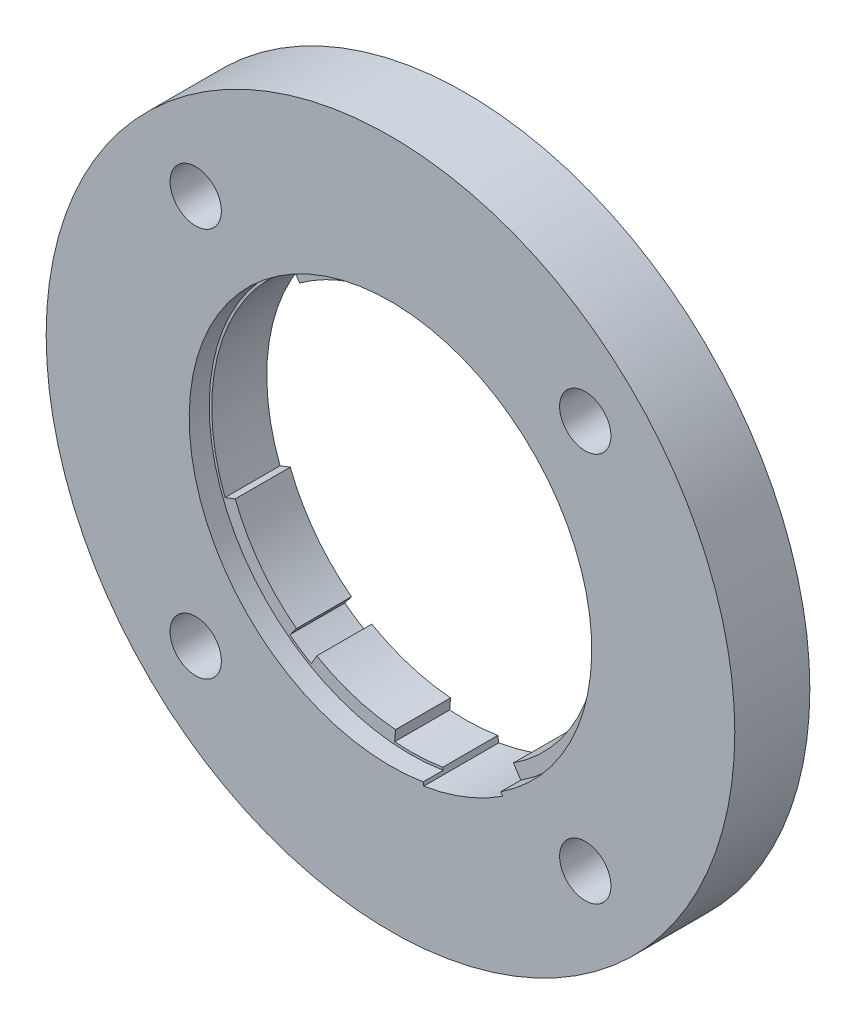
ISO-10303-21;
HEADER;
FILE_DESCRIPTION(('STEP AP214'),'2;1');
FILE_NAME('part.step','',(''),(''),'','','');
FILE_SCHEMA(('AUTOMOTIVE_DESIGN { 1 0 10303 214 1 1 1 1 }'));
ENDSEC;
DATA;
#1=APPLICATION_CONTEXT('core data for automotive mechanical design processes');
#2=APPLICATION_PROTOCOL_DEFINITION('international standard','automotive_design',2000,#1);
#3=PRODUCT_CONTEXT('',#1,'mechanical');
#4=PRODUCT('Part','Part','',(#3));
#5=PRODUCT_RELATED_PRODUCT_CATEGORY('part','',(#4));
#6=PRODUCT_DEFINITION_FORMATION('','',#4);
#7=PRODUCT_DEFINITION_CONTEXT('part definition',#1,'design');
#8=PRODUCT_DEFINITION('design','',#6,#7);
#9=PRODUCT_DEFINITION_SHAPE('','',#8);
#10=(LENGTH_UNIT() NAMED_UNIT(*) SI_UNIT(.MILLI.,.METRE.));
#11=(NAMED_UNIT(*) PLANE_ANGLE_UNIT() SI_UNIT($,.RADIAN.));
#12=(NAMED_UNIT(*) SI_UNIT($,.STERADIAN.) SOLID_ANGLE_UNIT());
#13=UNCERTAINTY_MEASURE_WITH_UNIT(LENGTH_MEASURE(1.E-05),#10,'distance_accuracy_value','');
#14=(GEOMETRIC_REPRESENTATION_CONTEXT(3) GLOBAL_UNCERTAINTY_ASSIGNED_CONTEXT((#13)) GLOBAL_UNIT_ASSIGNED_CONTEXT((#10,
#11,#12)) REPRESENTATION_CONTEXT('',''));
#15=CARTESIAN_POINT('',(0.,0.,0.));
#16=DIRECTION('',(0.,0.,1.));
#17=DIRECTION('',(1.,0.,0.));
#18=AXIS2_PLACEMENT_3D('',#15,#16,#17);
#19=CARTESIAN_POINT('',(0.,0.,1.02447722221638));
#20=DIRECTION('',(0.,0.,1.));
#21=DIRECTION('',(1.,0.,0.));
#22=AXIS2_PLACEMENT_3D('',#19,#20,#21);
#23=CYLINDRICAL_SURFACE('',#22,15.875);
#24=DIRECTION('',(0.,0.,-1.));
#25=VECTOR('',#24,1.);
#26=CARTESIAN_POINT('',(-2.25753554217916,15.7136615171575,31.5336184854115));
#27=LINE('',#26,#25);
#28=CARTESIAN_POINT('',(-2.25753554217916,15.7136615171575,4.394));
#29=VERTEX_POINT('',#28);
#30=CARTESIAN_POINT('',(-2.25753554217916,15.7136615171575,0.));
#31=VERTEX_POINT('',#30);
#32=EDGE_CURVE('E179',#29,#31,#27,.T.);
#33=ORIENTED_EDGE('',*,*,#32,.T.);
#34=CARTESIAN_POINT('',(0.,0.,0.));
#35=DIRECTION('',(0.,0.,1.));
#36=DIRECTION('',(1.,0.,0.));
#37=AXIS2_PLACEMENT_3D('',#34,#35,#36);
#38=CIRCLE('',#37,15.875);
#39=CARTESIAN_POINT('',(10.6425306707465,11.7793109273089,0.));
#40=VERTEX_POINT('',#39);
#41=EDGE_CURVE('E182',#40,#31,#38,.T.);
#42=ORIENTED_EDGE('',*,*,#41,.F.);
#43=DIRECTION('',(0.,0.,-1.));
#44=VECTOR('',#43,1.);
#45=CARTESIAN_POINT('',(10.6425306707465,11.7793109273089,31.5336184854115));
#46=LINE('',#45,#44);
#47=CARTESIAN_POINT('',(10.6425306707465,11.7793109273089,4.394));
#48=VERTEX_POINT('',#47);
#49=EDGE_CURVE('E284',#48,#40,#46,.T.);
#50=ORIENTED_EDGE('',*,*,#49,.F.);
#51=CARTESIAN_POINT('',(0.,0.,4.394));
#52=DIRECTION('',(0.,0.,1.));
#53=DIRECTION('',(1.,0.,0.));
#54=AXIS2_PLACEMENT_3D('',#51,#52,#53);
#55=CIRCLE('',#54,15.875);
#56=EDGE_CURVE('E184',#48,#29,#55,.T.);
#57=ORIENTED_EDGE('',*,*,#56,.T.);
#58=EDGE_LOOP('',(#33,#42,#50,#57));
#59=FACE_BOUND('',#58,.T.);
#60=ADVANCED_FACE('F41',(#59),#23,.F.);
#61=CARTESIAN_POINT('',(-9.36283564568387,12.8200208140202,0.));
#62=VERTEX_POINT('',#61);
#63=CARTESIAN_POINT('',(-14.8133156697239,-5.70800349238792,0.));
#64=VERTEX_POINT('',#63);
#65=EDGE_CURVE('E202',#62,#64,#38,.T.);
#66=ORIENTED_EDGE('',*,*,#65,.F.);
#67=DIRECTION('',(0.,0.,-1.));
#68=VECTOR('',#67,1.);
#69=CARTESIAN_POINT('',(-9.36283564568387,12.8200208140202,31.5336184854115));
#70=LINE('',#69,#68);
#71=CARTESIAN_POINT('',(-9.36283564568387,12.8200208140202,4.394));
#72=VERTEX_POINT('',#71);
#73=EDGE_CURVE('E190',#72,#62,#70,.T.);
#74=ORIENTED_EDGE('',*,*,#73,.F.);
#75=CARTESIAN_POINT('',(-14.8133156697239,-5.70800349238792,4.394));
#76=VERTEX_POINT('',#75);
#77=EDGE_CURVE('E320',#72,#76,#55,.T.);
#78=ORIENTED_EDGE('',*,*,#77,.T.);
#79=DIRECTION('',(0.,0.,-1.));
#80=VECTOR('',#79,1.);
#81=CARTESIAN_POINT('',(-14.8133156697239,-5.70800349238792,31.5336184854115));
#82=LINE('',#81,#80);
#83=EDGE_CURVE('E246',#76,#64,#82,.T.);
#84=ORIENTED_EDGE('',*,*,#83,.T.);
#85=EDGE_LOOP('',(#66,#74,#78,#84));
#86=FACE_BOUND('',#85,.T.);
#87=ADVANCED_FACE('F361',(#86),#23,.F.);
#88=CARTESIAN_POINT('',(-9.64214090906731,-12.6112942908209,0.));
#89=VERTEX_POINT('',#88);
#90=CARTESIAN_POINT('',(-7.9242350534155,-13.755803277825,0.));
#91=VERTEX_POINT('',#90);
#92=EDGE_CURVE('E364',#89,#91,#38,.T.);
#93=ORIENTED_EDGE('',*,*,#92,.F.);
#94=DIRECTION('',(0.,0.,-1.));
#95=VECTOR('',#94,1.);
#96=CARTESIAN_POINT('',(-9.64214090906731,-12.6112942908209,31.5336184854115));
#97=LINE('',#96,#95);
#98=CARTESIAN_POINT('',(-9.64214090906731,-12.6112942908209,4.394));
#99=VERTEX_POINT('',#98);
#100=EDGE_CURVE('E249',#99,#89,#97,.T.);
#101=ORIENTED_EDGE('',*,*,#100,.F.);
#102=CARTESIAN_POINT('',(-7.9242350534155,-13.755803277825,4.394));
#103=VERTEX_POINT('',#102);
#104=EDGE_CURVE('E378',#99,#103,#55,.T.);
#105=ORIENTED_EDGE('',*,*,#104,.T.);
#106=DIRECTION('',(0.,0.,-1.));
#107=VECTOR('',#106,1.);
#108=CARTESIAN_POINT('',(-7.92423505341551,-13.755803277825,31.5336184854115));
#109=LINE('',#108,#107);
#110=EDGE_CURVE('E258',#103,#91,#109,.T.);
#111=ORIENTED_EDGE('',*,*,#110,.T.);
#112=EDGE_LOOP('',(#93,#101,#105,#111));
#113=FACE_BOUND('',#112,.T.);
#114=ADVANCED_FACE('F381',(#113),#23,.F.);
#115=CARTESIAN_POINT('',(-1.26611035247322,-15.8244301500989,4.394));
#116=VERTEX_POINT('',#115);
#117=CARTESIAN_POINT('',(2.57776787710527,-15.6643141494214,4.394));
#118=VERTEX_POINT('',#117);
#119=EDGE_CURVE('E315',#116,#118,#55,.T.);
#120=ORIENTED_EDGE('',*,*,#119,.T.);
#121=DIRECTION('',(0.,0.,1.));
#122=VECTOR('',#121,1.);
#123=CARTESIAN_POINT('',(2.57776787710527,-15.6643141494214,1.02447722221638));
#124=LINE('',#123,#122);
#125=CARTESIAN_POINT('',(2.57776787710527,-15.6643141494214,0.));
#126=VERTEX_POINT('',#125);
#127=EDGE_CURVE('E334',#118,#126,#124,.F.);
#128=ORIENTED_EDGE('',*,*,#127,.T.);
#129=CARTESIAN_POINT('',(-1.26611035247322,-15.8244301500989,0.));
#130=VERTEX_POINT('',#129);
#131=EDGE_CURVE('E204',#130,#126,#38,.T.);
#132=ORIENTED_EDGE('',*,*,#131,.F.);
#133=DIRECTION('',(0.,0.,-1.));
#134=VECTOR('',#133,1.);
#135=CARTESIAN_POINT('',(-1.26611035247322,-15.8244301500989,31.5336184854115));
#136=LINE('',#135,#134);
#137=EDGE_CURVE('E273',#116,#130,#136,.T.);
#138=ORIENTED_EDGE('',*,*,#137,.F.);
#139=EDGE_LOOP('',(#120,#128,#132,#138));
#140=FACE_BOUND('',#139,.T.);
#141=ADVANCED_FACE('F43',(#140),#23,.F.);
#142=CARTESIAN_POINT('',(-15.875,0.,0.));
#143=DIRECTION('',(0.,0.,1.));
#144=DIRECTION('',(1.,0.,0.));
#145=AXIS2_PLACEMENT_3D('',#142,#143,#144);
#146=PLANE('',#145);
#147=CARTESIAN_POINT('',(-15.5563491861041,-15.556349186104,0.));
#148=DIRECTION('',(0.,0.,1.));
#149=DIRECTION('',(1.,0.,0.));
#150=AXIS2_PLACEMENT_3D('',#147,#148,#149);
#151=CIRCLE('',#150,2.05);
#152=CARTESIAN_POINT('',(-13.5063491861041,-15.556349186104,0.));
#153=VERTEX_POINT('',#152);
#154=EDGE_CURVE('E307',#153,#153,#151,.T.);
#155=ORIENTED_EDGE('',*,*,#154,.T.);
#156=EDGE_LOOP('',(#155));
#157=FACE_BOUND('',#156,.T.);
#158=CARTESIAN_POINT('',(15.556349186104,-15.5563491861041,0.));
#159=DIRECTION('',(0.,0.,1.));
#160=DIRECTION('',(1.,0.,0.));
#161=AXIS2_PLACEMENT_3D('',#158,#159,#160);
#162=CIRCLE('',#161,2.05);
#163=CARTESIAN_POINT('',(17.606349186104,-15.5563491861041,0.));
#164=VERTEX_POINT('',#163);
#165=EDGE_CURVE('E301',#164,#164,#162,.T.);
#166=ORIENTED_EDGE('',*,*,#165,.T.);
#167=EDGE_LOOP('',(#166));
#168=FACE_BOUND('',#167,.T.);
#169=CARTESIAN_POINT('',(15.5563491861041,15.556349186104,0.));
#170=DIRECTION('',(0.,0.,1.));
#171=DIRECTION('',(1.,0.,0.));
#172=AXIS2_PLACEMENT_3D('',#169,#170,#171);
#173=CIRCLE('',#172,2.05);
#174=CARTESIAN_POINT('',(17.6063491861041,15.556349186104,0.));
#175=VERTEX_POINT('',#174);
#176=EDGE_CURVE('E294',#175,#175,#173,.T.);
#177=ORIENTED_EDGE('',*,*,#176,.T.);
#178=EDGE_LOOP('',(#177));
#179=FACE_BOUND('',#178,.T.);
#180=CARTESIAN_POINT('',(-15.556349186104,15.5563491861041,0.));
#181=DIRECTION('',(0.,0.,1.));
#182=DIRECTION('',(1.,0.,0.));
#183=AXIS2_PLACEMENT_3D('',#180,#181,#182);
#184=CIRCLE('',#183,2.05);
#185=CARTESIAN_POINT('',(-13.506349186104,15.5563491861041,0.));
#186=VERTEX_POINT('',#185);
#187=EDGE_CURVE('E297',#186,#186,#184,.T.);
#188=ORIENTED_EDGE('',*,*,#187,.T.);
#189=EDGE_LOOP('',(#188));
#190=FACE_BOUND('',#189,.T.);
#191=CARTESIAN_POINT('',(0.,0.,0.));
#192=DIRECTION('',(0.,0.,1.));
#193=DIRECTION('',(1.,0.,0.));
#194=AXIS2_PLACEMENT_3D('',#191,#192,#193);
#195=CIRCLE('',#194,27.5);
#196=CARTESIAN_POINT('',(27.5,0.,0.));
#197=VERTEX_POINT('',#196);
#198=EDGE_CURVE('E329',#197,#197,#195,.T.);
#199=ORIENTED_EDGE('',*,*,#198,.F.);
#200=EDGE_LOOP('',(#199));
#201=FACE_BOUND('',#200,.T.);
#202=CARTESIAN_POINT('',(0.,0.,0.));
#203=DIRECTION('',(0.,0.,-1.));
#204=DIRECTION('',(-1.,0.,0.));
#205=AXIS2_PLACEMENT_3D('',#202,#203,#204);
#206=CIRCLE('',#205,16.3552779055001);
#207=CARTESIAN_POINT('',(8.96301063267659,-13.6806270238124,0.));
#208=VERTEX_POINT('',#207);
#209=CARTESIAN_POINT('',(2.65575496100332,-16.1382180228564,0.));
#210=VERTEX_POINT('',#209);
#211=EDGE_CURVE('E45',#208,#210,#206,.T.);
#212=ORIENTED_EDGE('',*,*,#211,.F.);
#213=DIRECTION('',(-0.548019464081526,0.836465580276796,0.));
#214=VECTOR('',#213,1.);
#215=CARTESIAN_POINT('',(-4.76766466156872,7.27709077703668,0.));
#216=LINE('',#215,#214);
#217=CARTESIAN_POINT('',(8.22029196122289,-12.5469837041519,0.));
#218=VERTEX_POINT('',#217);
#219=EDGE_CURVE('E72',#208,#218,#216,.T.);
#220=ORIENTED_EDGE('',*,*,#219,.T.);
#221=CARTESIAN_POINT('',(0.,0.,0.));
#222=DIRECTION('',(0.,0.,-1.));
#223=DIRECTION('',(-1.,0.,0.));
#224=AXIS2_PLACEMENT_3D('',#221,#222,#223);
#225=CIRCLE('',#224,15.);
#226=CARTESIAN_POINT('',(10.0559344920439,11.1300575691108,0.));
#227=VERTEX_POINT('',#226);
#228=EDGE_CURVE('E280',#218,#227,#225,.F.);
#229=ORIENTED_EDGE('',*,*,#228,.T.);
#230=DIRECTION('',(0.67039563280293,0.74200383794072,0.));
#231=VECTOR('',#230,1.);
#232=CARTESIAN_POINT('',(0.,0.,0.));
#233=LINE('',#232,#231);
#234=EDGE_CURVE('E201',#227,#40,#233,.T.);
#235=ORIENTED_EDGE('',*,*,#234,.T.);
#236=ORIENTED_EDGE('',*,*,#41,.T.);
#237=DIRECTION('',(-0.142206963286876,0.98983694596268,0.));
#238=VECTOR('',#237,1.);
#239=CARTESIAN_POINT('',(0.,0.,0.));
#240=LINE('',#239,#238);
#241=CARTESIAN_POINT('',(-2.13310444930314,14.8475541894402,0.));
#242=VERTEX_POINT('',#241);
#243=EDGE_CURVE('E198',#242,#31,#240,.T.);
#244=ORIENTED_EDGE('',*,*,#243,.F.);
#245=CARTESIAN_POINT('',(0.,0.,0.));
#246=DIRECTION('',(0.,0.,-1.));
#247=DIRECTION('',(-1.,0.,0.));
#248=AXIS2_PLACEMENT_3D('',#245,#246,#247);
#249=CIRCLE('',#248,15.);
#250=CARTESIAN_POINT('',(-8.84677383844145,12.1134054935624,0.));
#251=VERTEX_POINT('',#250);
#252=EDGE_CURVE('E208',#242,#251,#249,.F.);
#253=ORIENTED_EDGE('',*,*,#252,.T.);
#254=DIRECTION('',(-0.589784922562763,0.807560366237494,0.));
#255=VECTOR('',#254,1.);
#256=CARTESIAN_POINT('',(0.,0.,0.));
#257=LINE('',#256,#255);
#258=EDGE_CURVE('E210',#251,#62,#257,.T.);
#259=ORIENTED_EDGE('',*,*,#258,.T.);
#260=ORIENTED_EDGE('',*,*,#65,.T.);
#261=DIRECTION('',(-0.933122246911741,-0.35955927511105,0.));
#262=VECTOR('',#261,1.);
#263=CARTESIAN_POINT('',(0.,0.,0.));
#264=LINE('',#263,#262);
#265=CARTESIAN_POINT('',(-13.9968337036761,-5.39338912666575,0.));
#266=VERTEX_POINT('',#265);
#267=EDGE_CURVE('E241',#266,#64,#264,.T.);
#268=ORIENTED_EDGE('',*,*,#267,.F.);
#269=CARTESIAN_POINT('',(0.,0.,0.));
#270=DIRECTION('',(0.,0.,-1.));
#271=DIRECTION('',(-1.,0.,0.));
#272=AXIS2_PLACEMENT_3D('',#269,#270,#271);
#273=CIRCLE('',#272,15.);
#274=CARTESIAN_POINT('',(-9.11068432352817,-11.916183581878,0.));
#275=VERTEX_POINT('',#274);
#276=EDGE_CURVE('E227',#275,#266,#273,.T.);
#277=ORIENTED_EDGE('',*,*,#276,.F.);
#278=DIRECTION('',(-0.607378954901877,-0.794412238791865,0.));
#279=VECTOR('',#278,1.);
#280=CARTESIAN_POINT('',(0.,0.,0.));
#281=LINE('',#280,#279);
#282=EDGE_CURVE('E238',#275,#89,#281,.T.);
#283=ORIENTED_EDGE('',*,*,#282,.T.);
#284=ORIENTED_EDGE('',*,*,#92,.T.);
#285=DIRECTION('',(-0.499164412813573,-0.86650729309134,0.));
#286=VECTOR('',#285,1.);
#287=CARTESIAN_POINT('',(0.,0.,0.));
#288=LINE('',#287,#286);
#289=CARTESIAN_POINT('',(-7.48746619220363,-12.9976093963701,0.));
#290=VERTEX_POINT('',#289);
#291=EDGE_CURVE('E254',#290,#91,#288,.T.);
#292=ORIENTED_EDGE('',*,*,#291,.F.);
#293=CARTESIAN_POINT('',(0.,0.,0.));
#294=DIRECTION('',(0.,0.,-1.));
#295=DIRECTION('',(-1.,0.,0.));
#296=AXIS2_PLACEMENT_3D('',#293,#294,#295);
#297=CIRCLE('',#296,15.);
#298=CARTESIAN_POINT('',(-1.19632474249438,-14.9522174646604,0.));
#299=VERTEX_POINT('',#298);
#300=EDGE_CURVE('E264',#290,#299,#297,.F.);
#301=ORIENTED_EDGE('',*,*,#300,.T.);
#302=DIRECTION('',(-0.0797549828329585,-0.996814497644027,0.));
#303=VECTOR('',#302,1.);
#304=CARTESIAN_POINT('',(0.,0.,0.));
#305=LINE('',#304,#303);
#306=EDGE_CURVE('E267',#299,#130,#305,.T.);
#307=ORIENTED_EDGE('',*,*,#306,.T.);
#308=ORIENTED_EDGE('',*,*,#131,.T.);
#309=DIRECTION('',(0.162379078872773,-0.986728450357255,0.));
#310=VECTOR('',#309,1.);
#311=CARTESIAN_POINT('',(-0.418575573432176,2.54355690275679,0.));
#312=LINE('',#311,#310);
#313=EDGE_CURVE('E213',#126,#210,#312,.T.);
#314=ORIENTED_EDGE('',*,*,#313,.T.);
#315=EDGE_LOOP('',(#212,#220,#229,#235,#236,#244,#253,#259,#260,#268,#277,#283,#284,#292,#301,
#307,#308,#314));
#316=FACE_BOUND('',#315,.T.);
#317=ADVANCED_FACE('F196',(#157,#168,#179,#190,#201,#316),#146,.F.);
#318=CARTESIAN_POINT('',(0.,0.,1.02447722221638));
#319=DIRECTION('',(0.,0.,1.));
#320=DIRECTION('',(1.,0.,0.));
#321=AXIS2_PLACEMENT_3D('',#318,#319,#320);
#322=CYLINDRICAL_SURFACE('',#321,27.5);
#323=CARTESIAN_POINT('',(0.,0.,5.994));
#324=DIRECTION('',(0.,0.,1.));
#325=DIRECTION('',(1.,0.,0.));
#326=AXIS2_PLACEMENT_3D('',#323,#324,#325);
#327=CIRCLE('',#326,27.5);
#328=CARTESIAN_POINT('',(27.5,0.,5.994));
#329=VERTEX_POINT('',#328);
#330=EDGE_CURVE('E326',#329,#329,#327,.T.);
#331=ORIENTED_EDGE('',*,*,#330,.F.);
#332=EDGE_LOOP('',(#331));
#333=FACE_BOUND('',#332,.T.);
#334=ORIENTED_EDGE('',*,*,#198,.T.);
#335=EDGE_LOOP('',(#334));
#336=FACE_BOUND('',#335,.T.);
#337=ADVANCED_FACE('F412',(#333,#336),#322,.T.);
#338=CARTESIAN_POINT('',(-27.5,0.,5.994));
#339=DIRECTION('',(0.,0.,-1.));
#340=DIRECTION('',(-1.,0.,0.));
#341=AXIS2_PLACEMENT_3D('',#338,#339,#340);
#342=PLANE('',#341);
#343=CARTESIAN_POINT('',(-15.5563491861041,-15.556349186104,5.994));
#344=DIRECTION('',(0.,0.,1.));
#345=DIRECTION('',(1.,0.,0.));
#346=AXIS2_PLACEMENT_3D('',#343,#344,#345);
#347=CIRCLE('',#346,2.05);
#348=CARTESIAN_POINT('',(-13.5063491861041,-15.556349186104,5.994));
#349=VERTEX_POINT('',#348);
#350=EDGE_CURVE('E293',#349,#349,#347,.T.);
#351=ORIENTED_EDGE('',*,*,#350,.F.);
#352=EDGE_LOOP('',(#351));
#353=FACE_BOUND('',#352,.T.);
#354=CARTESIAN_POINT('',(15.556349186104,-15.5563491861041,5.994));
#355=DIRECTION('',(0.,0.,1.));
#356=DIRECTION('',(1.,0.,0.));
#357=AXIS2_PLACEMENT_3D('',#354,#355,#356);
#358=CIRCLE('',#357,2.05);
#359=CARTESIAN_POINT('',(17.606349186104,-15.5563491861041,5.994));
#360=VERTEX_POINT('',#359);
#361=EDGE_CURVE('E304',#360,#360,#358,.T.);
#362=ORIENTED_EDGE('',*,*,#361,.F.);
#363=EDGE_LOOP('',(#362));
#364=FACE_BOUND('',#363,.T.);
#365=CARTESIAN_POINT('',(15.5563491861041,15.556349186104,5.994));
#366=DIRECTION('',(0.,0.,1.));
#367=DIRECTION('',(1.,0.,0.));
#368=AXIS2_PLACEMENT_3D('',#365,#366,#367);
#369=CIRCLE('',#368,2.05);
#370=CARTESIAN_POINT('',(17.6063491861041,15.556349186104,5.994));
#371=VERTEX_POINT('',#370);
#372=EDGE_CURVE('E298',#371,#371,#369,.T.);
#373=ORIENTED_EDGE('',*,*,#372,.F.);
#374=EDGE_LOOP('',(#373));
#375=FACE_BOUND('',#374,.T.);
#376=CARTESIAN_POINT('',(-15.556349186104,15.5563491861041,5.994));
#377=DIRECTION('',(0.,0.,1.));
#378=DIRECTION('',(1.,0.,0.));
#379=AXIS2_PLACEMENT_3D('',#376,#377,#378);
#380=CIRCLE('',#379,2.05);
#381=CARTESIAN_POINT('',(-13.506349186104,15.5563491861041,5.994));
#382=VERTEX_POINT('',#381);
#383=EDGE_CURVE('E312',#382,#382,#380,.T.);
#384=ORIENTED_EDGE('',*,*,#383,.F.);
#385=EDGE_LOOP('',(#384));
#386=FACE_BOUND('',#385,.T.);
#387=CARTESIAN_POINT('',(0.,0.,5.994));
#388=DIRECTION('',(0.,0.,1.));
#389=DIRECTION('',(1.,0.,0.));
#390=AXIS2_PLACEMENT_3D('',#387,#388,#389);
#391=CIRCLE('',#390,16.075);
#392=CARTESIAN_POINT('',(8.80941288511053,-13.4461842029495,5.994));
#393=VERTEX_POINT('',#392);
#394=CARTESIAN_POINT('',(2.61024369287982,-15.8616598394929,5.994));
#395=VERTEX_POINT('',#394);
#396=EDGE_CURVE('E323',#393,#395,#391,.T.);
#397=ORIENTED_EDGE('',*,*,#396,.F.);
#398=DIRECTION('',(0.548019464081526,-0.836465580276796,0.));
#399=VECTOR('',#398,1.);
#400=CARTESIAN_POINT('',(8.96301063267659,-13.6806270238124,5.994));
#401=LINE('',#400,#399);
#402=CARTESIAN_POINT('',(8.96301063267659,-13.6806270238124,5.994));
#403=VERTEX_POINT('',#402);
#404=EDGE_CURVE('E80',#393,#403,#401,.T.);
#405=ORIENTED_EDGE('',*,*,#404,.T.);
#406=CARTESIAN_POINT('',(0.,0.,5.994));
#407=DIRECTION('',(0.,0.,-1.));
#408=DIRECTION('',(-1.,0.,0.));
#409=AXIS2_PLACEMENT_3D('',#406,#407,#408);
#410=CIRCLE('',#409,16.3552779055001);
#411=CARTESIAN_POINT('',(2.65575496100332,-16.1382180228564,5.994));
#412=VERTEX_POINT('',#411);
#413=EDGE_CURVE('E538',#403,#412,#410,.T.);
#414=ORIENTED_EDGE('',*,*,#413,.T.);
#415=DIRECTION('',(-0.162379078872773,0.986728450357255,0.));
#416=VECTOR('',#415,1.);
#417=CARTESIAN_POINT('',(0.,0.,5.994));
#418=LINE('',#417,#416);
#419=EDGE_CURVE('E543',#412,#395,#418,.T.);
#420=ORIENTED_EDGE('',*,*,#419,.T.);
#421=EDGE_LOOP('',(#397,#405,#414,#420));
#422=FACE_BOUND('',#421,.T.);
#423=ORIENTED_EDGE('',*,*,#330,.T.);
#424=EDGE_LOOP('',(#423));
#425=FACE_BOUND('',#424,.T.);
#426=ADVANCED_FACE('F545',(#353,#364,#375,#386,#422,#425),#342,.F.);
#427=CARTESIAN_POINT('',(0.,0.,1.02447722221638));
#428=DIRECTION('',(0.,0.,1.));
#429=DIRECTION('',(1.,0.,0.));
#430=AXIS2_PLACEMENT_3D('',#427,#428,#429);
#431=CYLINDRICAL_SURFACE('',#430,16.075);
#432=CARTESIAN_POINT('',(0.,0.,4.394));
#433=DIRECTION('',(0.,0.,1.));
#434=DIRECTION('',(1.,0.,0.));
#435=AXIS2_PLACEMENT_3D('',#432,#433,#434);
#436=CIRCLE('',#435,16.075);
#437=CARTESIAN_POINT('',(8.80941288511053,-13.4461842029495,4.394));
#438=VERTEX_POINT('',#437);
#439=CARTESIAN_POINT('',(2.61024369287982,-15.8616598394929,4.394));
#440=VERTEX_POINT('',#439);
#441=EDGE_CURVE('E319',#438,#440,#436,.T.);
#442=ORIENTED_EDGE('',*,*,#441,.F.);
#443=DIRECTION('',(0.,0.,1.));
#444=VECTOR('',#443,1.);
#445=CARTESIAN_POINT('',(8.80941288511053,-13.4461842029495,1.02447722221638));
#446=LINE('',#445,#444);
#447=EDGE_CURVE('E336',#438,#393,#446,.T.);
#448=ORIENTED_EDGE('',*,*,#447,.T.);
#449=ORIENTED_EDGE('',*,*,#396,.T.);
#450=DIRECTION('',(0.,0.,1.));
#451=VECTOR('',#450,1.);
#452=CARTESIAN_POINT('',(2.61024369287982,-15.8616598394929,1.02447722221638));
#453=LINE('',#452,#451);
#454=EDGE_CURVE('E335',#395,#440,#453,.F.);
#455=ORIENTED_EDGE('',*,*,#454,.T.);
#456=EDGE_LOOP('',(#442,#448,#449,#455));
#457=FACE_BOUND('',#456,.T.);
#458=ADVANCED_FACE('F549',(#457),#431,.F.);
#459=CARTESIAN_POINT('',(-16.075,0.,4.394));
#460=DIRECTION('',(0.,0.,-1.));
#461=DIRECTION('',(-1.,0.,0.));
#462=AXIS2_PLACEMENT_3D('',#459,#460,#461);
#463=PLANE('',#462);
#464=CARTESIAN_POINT('',(0.,0.,4.394));
#465=DIRECTION('',(0.,0.,-1.));
#466=DIRECTION('',(-1.,0.,0.));
#467=AXIS2_PLACEMENT_3D('',#464,#465,#466);
#468=CIRCLE('',#467,15.);
#469=CARTESIAN_POINT('',(10.0559344920439,11.1300575691108,4.394));
#470=VERTEX_POINT('',#469);
#471=CARTESIAN_POINT('',(8.22029196122289,-12.5469837041519,4.394));
#472=VERTEX_POINT('',#471);
#473=EDGE_CURVE('E283',#470,#472,#468,.T.);
#474=ORIENTED_EDGE('',*,*,#473,.T.);
#475=DIRECTION('',(0.548019464081526,-0.836465580276796,0.));
#476=VECTOR('',#475,1.);
#477=CARTESIAN_POINT('',(-4.82772972817116,7.36877066084186,4.394));
#478=LINE('',#477,#476);
#479=EDGE_CURVE('E60',#472,#438,#478,.T.);
#480=ORIENTED_EDGE('',*,*,#479,.T.);
#481=ORIENTED_EDGE('',*,*,#441,.T.);
#482=DIRECTION('',(-0.162379078872773,0.986728450357255,0.));
#483=VECTOR('',#482,1.);
#484=CARTESIAN_POINT('',(-0.42384896648329,2.57560171413011,4.394));
#485=LINE('',#484,#483);
#486=EDGE_CURVE('E11',#440,#118,#485,.T.);
#487=ORIENTED_EDGE('',*,*,#486,.T.);
#488=ORIENTED_EDGE('',*,*,#119,.F.);
#489=DIRECTION('',(0.0797549828329585,0.996814497644027,0.));
#490=VECTOR('',#489,1.);
#491=CARTESIAN_POINT('',(0.,0.,4.394));
#492=LINE('',#491,#490);
#493=CARTESIAN_POINT('',(-1.19632474249438,-14.9522174646604,4.394));
#494=VERTEX_POINT('',#493);
#495=EDGE_CURVE('E255',#116,#494,#492,.T.);
#496=ORIENTED_EDGE('',*,*,#495,.T.);
#497=CARTESIAN_POINT('',(0.,0.,4.394));
#498=DIRECTION('',(0.,0.,-1.));
#499=DIRECTION('',(-1.,0.,0.));
#500=AXIS2_PLACEMENT_3D('',#497,#498,#499);
#501=CIRCLE('',#500,15.);
#502=CARTESIAN_POINT('',(-7.48746619220363,-12.9976093963701,4.394));
#503=VERTEX_POINT('',#502);
#504=EDGE_CURVE('E261',#494,#503,#501,.T.);
#505=ORIENTED_EDGE('',*,*,#504,.T.);
#506=DIRECTION('',(0.499164412813573,0.86650729309134,0.));
#507=VECTOR('',#506,1.);
#508=CARTESIAN_POINT('',(0.,0.,4.394));
#509=LINE('',#508,#507);
#510=EDGE_CURVE('E257',#103,#503,#509,.T.);
#511=ORIENTED_EDGE('',*,*,#510,.F.);
#512=ORIENTED_EDGE('',*,*,#104,.F.);
#513=DIRECTION('',(0.607378954901877,0.794412238791865,0.));
#514=VECTOR('',#513,1.);
#515=CARTESIAN_POINT('',(0.,0.,4.394));
#516=LINE('',#515,#514);
#517=CARTESIAN_POINT('',(-9.11068432352817,-11.916183581878,4.394));
#518=VERTEX_POINT('',#517);
#519=EDGE_CURVE('E235',#99,#518,#516,.T.);
#520=ORIENTED_EDGE('',*,*,#519,.T.);
#521=CARTESIAN_POINT('',(0.,0.,4.394));
#522=DIRECTION('',(0.,0.,-1.));
#523=DIRECTION('',(-1.,0.,0.));
#524=AXIS2_PLACEMENT_3D('',#521,#522,#523);
#525=CIRCLE('',#524,15.);
#526=CARTESIAN_POINT('',(-13.9968337036761,-5.39338912666575,4.394));
#527=VERTEX_POINT('',#526);
#528=EDGE_CURVE('E231',#527,#518,#525,.F.);
#529=ORIENTED_EDGE('',*,*,#528,.F.);
#530=DIRECTION('',(0.933122246911741,0.35955927511105,0.));
#531=VECTOR('',#530,1.);
#532=CARTESIAN_POINT('',(0.,0.,4.394));
#533=LINE('',#532,#531);
#534=EDGE_CURVE('E228',#76,#527,#533,.T.);
#535=ORIENTED_EDGE('',*,*,#534,.F.);
#536=ORIENTED_EDGE('',*,*,#77,.F.);
#537=DIRECTION('',(0.589784922562763,-0.807560366237494,0.));
#538=VECTOR('',#537,1.);
#539=CARTESIAN_POINT('',(0.,0.,4.394));
#540=LINE('',#539,#538);
#541=CARTESIAN_POINT('',(-8.84677383844145,12.1134054935624,4.394));
#542=VERTEX_POINT('',#541);
#543=EDGE_CURVE('E189',#72,#542,#540,.T.);
#544=ORIENTED_EDGE('',*,*,#543,.T.);
#545=CARTESIAN_POINT('',(0.,0.,4.394));
#546=DIRECTION('',(0.,0.,-1.));
#547=DIRECTION('',(-1.,0.,0.));
#548=AXIS2_PLACEMENT_3D('',#545,#546,#547);
#549=CIRCLE('',#548,15.);
#550=CARTESIAN_POINT('',(-2.13310444930314,14.8475541894402,4.394));
#551=VERTEX_POINT('',#550);
#552=EDGE_CURVE('E225',#542,#551,#549,.T.);
#553=ORIENTED_EDGE('',*,*,#552,.T.);
#554=DIRECTION('',(0.142206963286876,-0.98983694596268,0.));
#555=VECTOR('',#554,1.);
#556=CARTESIAN_POINT('',(0.,0.,4.394));
#557=LINE('',#556,#555);
#558=EDGE_CURVE('E215',#29,#551,#557,.T.);
#559=ORIENTED_EDGE('',*,*,#558,.F.);
#560=ORIENTED_EDGE('',*,*,#56,.F.);
#561=DIRECTION('',(-0.67039563280293,-0.74200383794072,0.));
#562=VECTOR('',#561,1.);
#563=CARTESIAN_POINT('',(0.,0.,4.394));
#564=LINE('',#563,#562);
#565=EDGE_CURVE('E281',#48,#470,#564,.T.);
#566=ORIENTED_EDGE('',*,*,#565,.T.);
#567=EDGE_LOOP('',(#474,#480,#481,#487,#488,#496,#505,#511,#512,#520,#529,#535,#536,#544,#553,
#559,#560,#566));
#568=FACE_BOUND('',#567,.T.);
#569=ADVANCED_FACE('F376',(#568),#463,.F.);
#570=CARTESIAN_POINT('',(-15.556349186104,15.5563491861041,5.994));
#571=DIRECTION('',(0.,0.,-1.));
#572=DIRECTION('',(-1.,0.,0.));
#573=AXIS2_PLACEMENT_3D('',#570,#571,#572);
#574=CYLINDRICAL_SURFACE('',#573,2.05);
#575=ORIENTED_EDGE('',*,*,#383,.T.);
#576=EDGE_LOOP('',(#575));
#577=FACE_BOUND('',#576,.T.);
#578=ORIENTED_EDGE('',*,*,#187,.F.);
#579=EDGE_LOOP('',(#578));
#580=FACE_BOUND('',#579,.T.);
#581=ADVANCED_FACE('F562',(#577,#580),#574,.F.);
#582=CARTESIAN_POINT('',(15.5563491861041,15.556349186104,5.994));
#583=DIRECTION('',(0.,0.,-1.));
#584=DIRECTION('',(-1.,0.,0.));
#585=AXIS2_PLACEMENT_3D('',#582,#583,#584);
#586=CYLINDRICAL_SURFACE('',#585,2.05);
#587=ORIENTED_EDGE('',*,*,#372,.T.);
#588=EDGE_LOOP('',(#587));
#589=FACE_BOUND('',#588,.T.);
#590=ORIENTED_EDGE('',*,*,#176,.F.);
#591=EDGE_LOOP('',(#590));
#592=FACE_BOUND('',#591,.T.);
#593=ADVANCED_FACE('F558',(#589,#592),#586,.F.);
#594=CARTESIAN_POINT('',(15.556349186104,-15.5563491861041,5.994));
#595=DIRECTION('',(0.,0.,-1.));
#596=DIRECTION('',(-1.,0.,0.));
#597=AXIS2_PLACEMENT_3D('',#594,#595,#596);
#598=CYLINDRICAL_SURFACE('',#597,2.05);
#599=ORIENTED_EDGE('',*,*,#361,.T.);
#600=EDGE_LOOP('',(#599));
#601=FACE_BOUND('',#600,.T.);
#602=ORIENTED_EDGE('',*,*,#165,.F.);
#603=EDGE_LOOP('',(#602));
#604=FACE_BOUND('',#603,.T.);
#605=ADVANCED_FACE('F561',(#601,#604),#598,.F.);
#606=CARTESIAN_POINT('',(-15.5563491861041,-15.556349186104,5.994));
#607=DIRECTION('',(0.,0.,-1.));
#608=DIRECTION('',(-1.,0.,0.));
#609=AXIS2_PLACEMENT_3D('',#606,#607,#608);
#610=CYLINDRICAL_SURFACE('',#609,2.05);
#611=ORIENTED_EDGE('',*,*,#350,.T.);
#612=EDGE_LOOP('',(#611));
#613=FACE_BOUND('',#612,.T.);
#614=ORIENTED_EDGE('',*,*,#154,.F.);
#615=EDGE_LOOP('',(#614));
#616=FACE_BOUND('',#615,.T.);
#617=ADVANCED_FACE('F427',(#613,#616),#610,.F.);
#618=CARTESIAN_POINT('',(0.,0.,31.5336184854115));
#619=DIRECTION('',(-0.74200383794072,0.67039563280293,0.));
#620=DIRECTION('',(-0.67039563280293,-0.74200383794072,0.));
#621=AXIS2_PLACEMENT_3D('',#618,#619,#620);
#622=PLANE('',#621);
#623=ORIENTED_EDGE('',*,*,#565,.F.);
#624=ORIENTED_EDGE('',*,*,#49,.T.);
#625=ORIENTED_EDGE('',*,*,#234,.F.);
#626=DIRECTION('',(0.,0.,-1.));
#627=VECTOR('',#626,1.);
#628=CARTESIAN_POINT('',(10.0559344920439,11.1300575691108,31.5336184854115));
#629=LINE('',#628,#627);
#630=EDGE_CURVE('E287',#470,#227,#629,.T.);
#631=ORIENTED_EDGE('',*,*,#630,.F.);
#632=EDGE_LOOP('',(#623,#624,#625,#631));
#633=FACE_BOUND('',#632,.T.);
#634=ADVANCED_FACE('F422',(#633),#622,.T.);
#635=CARTESIAN_POINT('',(0.,0.,31.5336184854115));
#636=DIRECTION('',(0.,0.,-1.));
#637=DIRECTION('',(-1.,0.,0.));
#638=AXIS2_PLACEMENT_3D('',#635,#636,#637);
#639=CYLINDRICAL_SURFACE('',#638,15.);
#640=DIRECTION('',(0.,0.,-1.));
#641=VECTOR('',#640,1.);
#642=CARTESIAN_POINT('',(8.22029196122289,-12.5469837041519,31.5336184854115));
#643=LINE('',#642,#641);
#644=EDGE_CURVE('E51',#472,#218,#643,.T.);
#645=ORIENTED_EDGE('',*,*,#644,.F.);
#646=ORIENTED_EDGE('',*,*,#473,.F.);
#647=ORIENTED_EDGE('',*,*,#630,.T.);
#648=ORIENTED_EDGE('',*,*,#228,.F.);
#649=EDGE_LOOP('',(#645,#646,#647,#648));
#650=FACE_BOUND('',#649,.T.);
#651=ADVANCED_FACE('F426',(#650),#639,.F.);
#652=CARTESIAN_POINT('',(0.,0.,31.5336184854115));
#653=DIRECTION('',(0.86650729309134,-0.499164412813573,0.));
#654=DIRECTION('',(0.499164412813573,0.86650729309134,0.));
#655=AXIS2_PLACEMENT_3D('',#652,#653,#654);
#656=PLANE('',#655);
#657=ORIENTED_EDGE('',*,*,#110,.F.);
#658=ORIENTED_EDGE('',*,*,#510,.T.);
#659=DIRECTION('',(0.,0.,-1.));
#660=VECTOR('',#659,1.);
#661=CARTESIAN_POINT('',(-7.48746619220363,-12.9976093963701,31.5336184854115));
#662=LINE('',#661,#660);
#663=EDGE_CURVE('E270',#503,#290,#662,.T.);
#664=ORIENTED_EDGE('',*,*,#663,.T.);
#665=ORIENTED_EDGE('',*,*,#291,.T.);
#666=EDGE_LOOP('',(#657,#658,#664,#665));
#667=FACE_BOUND('',#666,.T.);
#668=ADVANCED_FACE('F386',(#667),#656,.F.);
#669=CARTESIAN_POINT('',(0.,0.,31.5336184854115));
#670=DIRECTION('',(0.996814497644027,-0.0797549828329585,0.));
#671=DIRECTION('',(0.0797549828329585,0.996814497644027,0.));
#672=AXIS2_PLACEMENT_3D('',#669,#670,#671);
#673=PLANE('',#672);
#674=ORIENTED_EDGE('',*,*,#495,.F.);
#675=ORIENTED_EDGE('',*,*,#137,.T.);
#676=ORIENTED_EDGE('',*,*,#306,.F.);
#677=DIRECTION('',(0.,0.,-1.));
#678=VECTOR('',#677,1.);
#679=CARTESIAN_POINT('',(-1.19632474249438,-14.9522174646604,31.5336184854115));
#680=LINE('',#679,#678);
#681=EDGE_CURVE('E276',#494,#299,#680,.T.);
#682=ORIENTED_EDGE('',*,*,#681,.F.);
#683=EDGE_LOOP('',(#674,#675,#676,#682));
#684=FACE_BOUND('',#683,.T.);
#685=ADVANCED_FACE('F373',(#684),#673,.T.);
#686=CARTESIAN_POINT('',(0.,0.,31.5336184854115));
#687=DIRECTION('',(0.,0.,-1.));
#688=DIRECTION('',(-1.,0.,0.));
#689=AXIS2_PLACEMENT_3D('',#686,#687,#688);
#690=CYLINDRICAL_SURFACE('',#689,15.);
#691=ORIENTED_EDGE('',*,*,#504,.F.);
#692=ORIENTED_EDGE('',*,*,#681,.T.);
#693=ORIENTED_EDGE('',*,*,#300,.F.);
#694=ORIENTED_EDGE('',*,*,#663,.F.);
#695=EDGE_LOOP('',(#691,#692,#693,#694));
#696=FACE_BOUND('',#695,.T.);
#697=ADVANCED_FACE('F389',(#696),#690,.F.);
#698=CARTESIAN_POINT('',(0.,0.,31.5336184854115));
#699=DIRECTION('',(0.,0.,-1.));
#700=DIRECTION('',(-1.,0.,0.));
#701=AXIS2_PLACEMENT_3D('',#698,#699,#700);
#702=CYLINDRICAL_SURFACE('',#701,15.);
#703=DIRECTION('',(0.,0.,-1.));
#704=VECTOR('',#703,1.);
#705=CARTESIAN_POINT('',(-13.9968337036761,-5.39338912666575,31.5336184854115));
#706=LINE('',#705,#704);
#707=EDGE_CURVE('E232',#527,#266,#706,.T.);
#708=ORIENTED_EDGE('',*,*,#707,.F.);
#709=ORIENTED_EDGE('',*,*,#528,.T.);
#710=DIRECTION('',(0.,0.,-1.));
#711=VECTOR('',#710,1.);
#712=CARTESIAN_POINT('',(-9.11068432352817,-11.916183581878,31.5336184854115));
#713=LINE('',#712,#711);
#714=EDGE_CURVE('E244',#518,#275,#713,.T.);
#715=ORIENTED_EDGE('',*,*,#714,.T.);
#716=ORIENTED_EDGE('',*,*,#276,.T.);
#717=EDGE_LOOP('',(#708,#709,#715,#716));
#718=FACE_BOUND('',#717,.T.);
#719=ADVANCED_FACE('F391',(#718),#702,.F.);
#720=CARTESIAN_POINT('',(0.,0.,31.5336184854115));
#721=DIRECTION('',(0.35955927511105,-0.933122246911741,0.));
#722=DIRECTION('',(0.933122246911741,0.35955927511105,0.));
#723=AXIS2_PLACEMENT_3D('',#720,#721,#722);
#724=PLANE('',#723);
#725=ORIENTED_EDGE('',*,*,#83,.F.);
#726=ORIENTED_EDGE('',*,*,#534,.T.);
#727=ORIENTED_EDGE('',*,*,#707,.T.);
#728=ORIENTED_EDGE('',*,*,#267,.T.);
#729=EDGE_LOOP('',(#725,#726,#727,#728));
#730=FACE_BOUND('',#729,.T.);
#731=ADVANCED_FACE('F397',(#730),#724,.F.);
#732=CARTESIAN_POINT('',(0.,0.,31.5336184854115));
#733=DIRECTION('',(0.794412238791865,-0.607378954901877,0.));
#734=DIRECTION('',(0.607378954901877,0.794412238791865,0.));
#735=AXIS2_PLACEMENT_3D('',#732,#733,#734);
#736=PLANE('',#735);
#737=ORIENTED_EDGE('',*,*,#519,.F.);
#738=ORIENTED_EDGE('',*,*,#100,.T.);
#739=ORIENTED_EDGE('',*,*,#282,.F.);
#740=ORIENTED_EDGE('',*,*,#714,.F.);
#741=EDGE_LOOP('',(#737,#738,#739,#740));
#742=FACE_BOUND('',#741,.T.);
#743=ADVANCED_FACE('F467',(#742),#736,.T.);
#744=CARTESIAN_POINT('',(0.,0.,31.5336184854115));
#745=DIRECTION('',(-0.98983694596268,-0.142206963286876,0.));
#746=DIRECTION('',(0.142206963286876,-0.98983694596268,0.));
#747=AXIS2_PLACEMENT_3D('',#744,#745,#746);
#748=PLANE('',#747);
#749=ORIENTED_EDGE('',*,*,#32,.F.);
#750=ORIENTED_EDGE('',*,*,#558,.T.);
#751=DIRECTION('',(0.,0.,-1.));
#752=VECTOR('',#751,1.);
#753=CARTESIAN_POINT('',(-2.13310444930314,14.8475541894402,31.5336184854115));
#754=LINE('',#753,#752);
#755=EDGE_CURVE('E207',#551,#242,#754,.T.);
#756=ORIENTED_EDGE('',*,*,#755,.T.);
#757=ORIENTED_EDGE('',*,*,#243,.T.);
#758=EDGE_LOOP('',(#749,#750,#756,#757));
#759=FACE_BOUND('',#758,.T.);
#760=ADVANCED_FACE('F205',(#759),#748,.F.);
#761=CARTESIAN_POINT('',(0.,0.,31.5336184854115));
#762=DIRECTION('',(-0.807560366237494,-0.589784922562763,0.));
#763=DIRECTION('',(0.589784922562763,-0.807560366237494,0.));
#764=AXIS2_PLACEMENT_3D('',#761,#762,#763);
#765=PLANE('',#764);
#766=ORIENTED_EDGE('',*,*,#543,.F.);
#767=ORIENTED_EDGE('',*,*,#73,.T.);
#768=ORIENTED_EDGE('',*,*,#258,.F.);
#769=DIRECTION('',(0.,0.,-1.));
#770=VECTOR('',#769,1.);
#771=CARTESIAN_POINT('',(-8.84677383844145,12.1134054935624,31.5336184854115));
#772=LINE('',#771,#770);
#773=EDGE_CURVE('E222',#542,#251,#772,.T.);
#774=ORIENTED_EDGE('',*,*,#773,.F.);
#775=EDGE_LOOP('',(#766,#767,#768,#774));
#776=FACE_BOUND('',#775,.T.);
#777=ADVANCED_FACE('F358',(#776),#765,.T.);
#778=CARTESIAN_POINT('',(0.,0.,31.5336184854115));
#779=DIRECTION('',(0.,0.,-1.));
#780=DIRECTION('',(-1.,0.,0.));
#781=AXIS2_PLACEMENT_3D('',#778,#779,#780);
#782=CYLINDRICAL_SURFACE('',#781,15.);
#783=ORIENTED_EDGE('',*,*,#552,.F.);
#784=ORIENTED_EDGE('',*,*,#773,.T.);
#785=ORIENTED_EDGE('',*,*,#252,.F.);
#786=ORIENTED_EDGE('',*,*,#755,.F.);
#787=EDGE_LOOP('',(#783,#784,#785,#786));
#788=FACE_BOUND('',#787,.T.);
#789=ADVANCED_FACE('F354',(#788),#782,.F.);
#790=CARTESIAN_POINT('',(0.,0.,5.994));
#791=DIRECTION('',(0.,0.,-1.));
#792=DIRECTION('',(-1.,0.,0.));
#793=AXIS2_PLACEMENT_3D('',#790,#791,#792);
#794=CYLINDRICAL_SURFACE('',#793,16.3552779055001);
#795=DIRECTION('',(0.,0.,-1.));
#796=VECTOR('',#795,1.);
#797=CARTESIAN_POINT('',(2.65575496100332,-16.1382180228564,5.994));
#798=LINE('',#797,#796);
#799=EDGE_CURVE('E534',#412,#210,#798,.T.);
#800=ORIENTED_EDGE('',*,*,#799,.F.);
#801=ORIENTED_EDGE('',*,*,#413,.F.);
#802=DIRECTION('',(0.,0.,-1.));
#803=VECTOR('',#802,1.);
#804=CARTESIAN_POINT('',(8.96301063267659,-13.6806270238124,5.994));
#805=LINE('',#804,#803);
#806=EDGE_CURVE('E344',#403,#208,#805,.T.);
#807=ORIENTED_EDGE('',*,*,#806,.T.);
#808=ORIENTED_EDGE('',*,*,#211,.T.);
#809=EDGE_LOOP('',(#800,#801,#807,#808));
#810=FACE_BOUND('',#809,.T.);
#811=ADVANCED_FACE('F501',(#810),#794,.F.);
#812=CARTESIAN_POINT('',(0.,0.,5.994));
#813=DIRECTION('',(-0.986728450357255,-0.162379078872773,0.));
#814=DIRECTION('',(0.162379078872773,-0.986728450357255,0.));
#815=AXIS2_PLACEMENT_3D('',#812,#813,#814);
#816=PLANE('',#815);
#817=ORIENTED_EDGE('',*,*,#127,.F.);
#818=ORIENTED_EDGE('',*,*,#486,.F.);
#819=ORIENTED_EDGE('',*,*,#454,.F.);
#820=ORIENTED_EDGE('',*,*,#419,.F.);
#821=ORIENTED_EDGE('',*,*,#799,.T.);
#822=ORIENTED_EDGE('',*,*,#313,.F.);
#823=EDGE_LOOP('',(#817,#818,#819,#820,#821,#822));
#824=FACE_BOUND('',#823,.T.);
#825=ADVANCED_FACE('F510',(#824),#816,.F.);
#826=CARTESIAN_POINT('',(8.96301063267659,-13.6806270238124,5.994));
#827=DIRECTION('',(0.836465580276796,0.548019464081526,0.));
#828=DIRECTION('',(-0.548019464081526,0.836465580276796,0.));
#829=AXIS2_PLACEMENT_3D('',#826,#827,#828);
#830=PLANE('',#829);
#831=ORIENTED_EDGE('',*,*,#806,.F.);
#832=ORIENTED_EDGE('',*,*,#404,.F.);
#833=ORIENTED_EDGE('',*,*,#447,.F.);
#834=ORIENTED_EDGE('',*,*,#479,.F.);
#835=ORIENTED_EDGE('',*,*,#644,.T.);
#836=ORIENTED_EDGE('',*,*,#219,.F.);
#837=EDGE_LOOP('',(#831,#832,#833,#834,#835,#836));
#838=FACE_BOUND('',#837,.T.);
#839=ADVANCED_FACE('F521',(#838),#830,.F.);
#840=CLOSED_SHELL('',(#60,#87,#114,#141,#317,#337,#426,#458,#569,#581,#593,#605,#617,#634,#651,
#668,#685,#697,#719,#731,#743,#760,#777,#789,#811,#825,#839));
#841=MANIFOLD_SOLID_BREP('B2',#840);
#842=ADVANCED_BREP_SHAPE_REPRESENTATION('',(#18,#841),#14);
#843=SHAPE_DEFINITION_REPRESENTATION(#9,#842);
ENDSEC;
END-ISO-10303-21;
